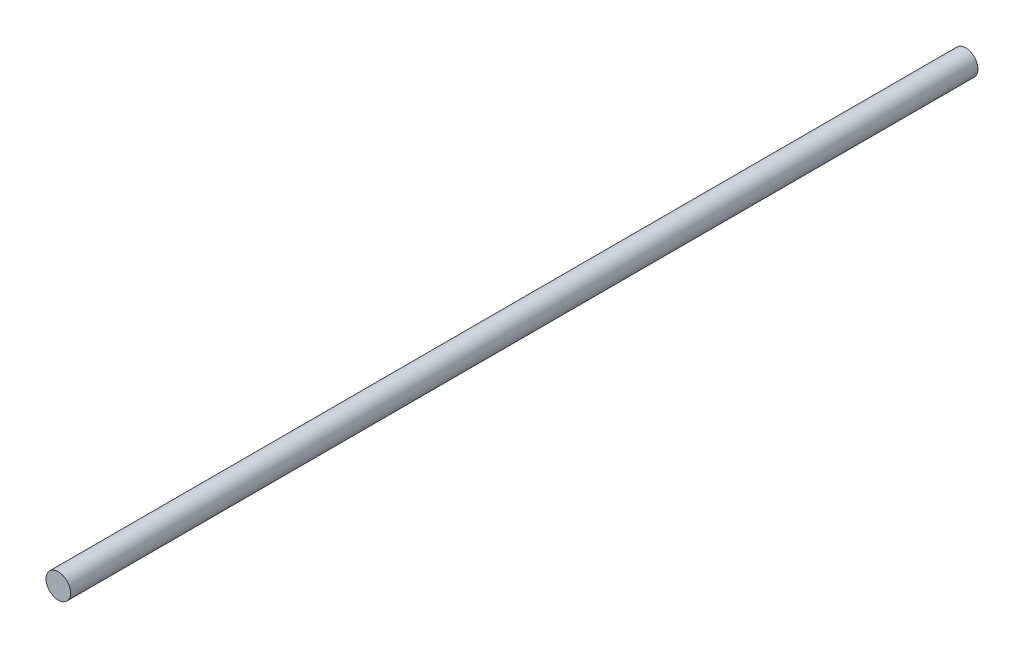
ISO-10303-21;
HEADER;
FILE_DESCRIPTION(('STEP AP214'),'2;1');
FILE_NAME('part.step','',(''),(''),'','','');
FILE_SCHEMA(('AUTOMOTIVE_DESIGN { 1 0 10303 214 1 1 1 1 }'));
ENDSEC;
DATA;
#1=APPLICATION_CONTEXT('core data for automotive mechanical design processes');
#2=APPLICATION_PROTOCOL_DEFINITION('international standard','automotive_design',2000,#1);
#3=PRODUCT_CONTEXT('',#1,'mechanical');
#4=PRODUCT('Part','Part','',(#3));
#5=PRODUCT_RELATED_PRODUCT_CATEGORY('part','',(#4));
#6=PRODUCT_DEFINITION_FORMATION('','',#4);
#7=PRODUCT_DEFINITION_CONTEXT('part definition',#1,'design');
#8=PRODUCT_DEFINITION('design','',#6,#7);
#9=PRODUCT_DEFINITION_SHAPE('','',#8);
#10=(LENGTH_UNIT() NAMED_UNIT(*) SI_UNIT(.MILLI.,.METRE.));
#11=(NAMED_UNIT(*) PLANE_ANGLE_UNIT() SI_UNIT($,.RADIAN.));
#12=(NAMED_UNIT(*) SI_UNIT($,.STERADIAN.) SOLID_ANGLE_UNIT());
#13=UNCERTAINTY_MEASURE_WITH_UNIT(LENGTH_MEASURE(1.E-05),#10,'distance_accuracy_value','');
#14=(GEOMETRIC_REPRESENTATION_CONTEXT(3) GLOBAL_UNCERTAINTY_ASSIGNED_CONTEXT((#13)) GLOBAL_UNIT_ASSIGNED_CONTEXT((#10,
#11,#12)) REPRESENTATION_CONTEXT('',''));
#15=CARTESIAN_POINT('',(0.,0.,0.));
#16=DIRECTION('',(0.,0.,1.));
#17=DIRECTION('',(1.,0.,0.));
#18=AXIS2_PLACEMENT_3D('',#15,#16,#17);
#19=CARTESIAN_POINT('',(0.,0.,155.));
#20=DIRECTION('',(0.,0.,-1.));
#21=DIRECTION('',(-1.,0.,0.));
#22=AXIS2_PLACEMENT_3D('',#19,#20,#21);
#23=CYLINDRICAL_SURFACE('',#22,2.105);
#24=CARTESIAN_POINT('',(0.,0.,155.));
#25=DIRECTION('',(0.,0.,1.));
#26=DIRECTION('',(1.,0.,0.));
#27=AXIS2_PLACEMENT_3D('',#24,#25,#26);
#28=CIRCLE('',#27,2.105);
#29=CARTESIAN_POINT('',(2.105,0.,155.));
#30=VERTEX_POINT('',#29);
#31=EDGE_CURVE('E10',#30,#30,#28,.T.);
#32=ORIENTED_EDGE('',*,*,#31,.F.);
#33=EDGE_LOOP('',(#32));
#34=FACE_BOUND('',#33,.T.);
#35=CARTESIAN_POINT('',(0.,0.,0.));
#36=DIRECTION('',(0.,0.,1.));
#37=DIRECTION('',(1.,0.,0.));
#38=AXIS2_PLACEMENT_3D('',#35,#36,#37);
#39=CIRCLE('',#38,2.105);
#40=CARTESIAN_POINT('',(2.105,0.,0.));
#41=VERTEX_POINT('',#40);
#42=EDGE_CURVE('E34',#41,#41,#39,.T.);
#43=ORIENTED_EDGE('',*,*,#42,.T.);
#44=EDGE_LOOP('',(#43));
#45=FACE_BOUND('',#44,.T.);
#46=ADVANCED_FACE('F31',(#34,#45),#23,.T.);
#47=CARTESIAN_POINT('',(0.,0.,155.));
#48=DIRECTION('',(0.,0.,1.));
#49=DIRECTION('',(1.,0.,0.));
#50=AXIS2_PLACEMENT_3D('',#47,#48,#49);
#51=PLANE('',#50);
#52=ORIENTED_EDGE('',*,*,#31,.T.);
#53=EDGE_LOOP('',(#52));
#54=FACE_BOUND('',#53,.T.);
#55=ADVANCED_FACE('F46',(#54),#51,.T.);
#56=CARTESIAN_POINT('',(0.,0.,0.));
#57=DIRECTION('',(0.,0.,1.));
#58=DIRECTION('',(1.,0.,0.));
#59=AXIS2_PLACEMENT_3D('',#56,#57,#58);
#60=PLANE('',#59);
#61=ORIENTED_EDGE('',*,*,#42,.F.);
#62=EDGE_LOOP('',(#61));
#63=FACE_BOUND('',#62,.T.);
#64=ADVANCED_FACE('F44',(#63),#60,.F.);
#65=CLOSED_SHELL('',(#46,#55,#64));
#66=MANIFOLD_SOLID_BREP('B2',#65);
#67=ADVANCED_BREP_SHAPE_REPRESENTATION('',(#18,#66),#14);
#68=SHAPE_DEFINITION_REPRESENTATION(#9,#67);
ENDSEC;
END-ISO-10303-21;
